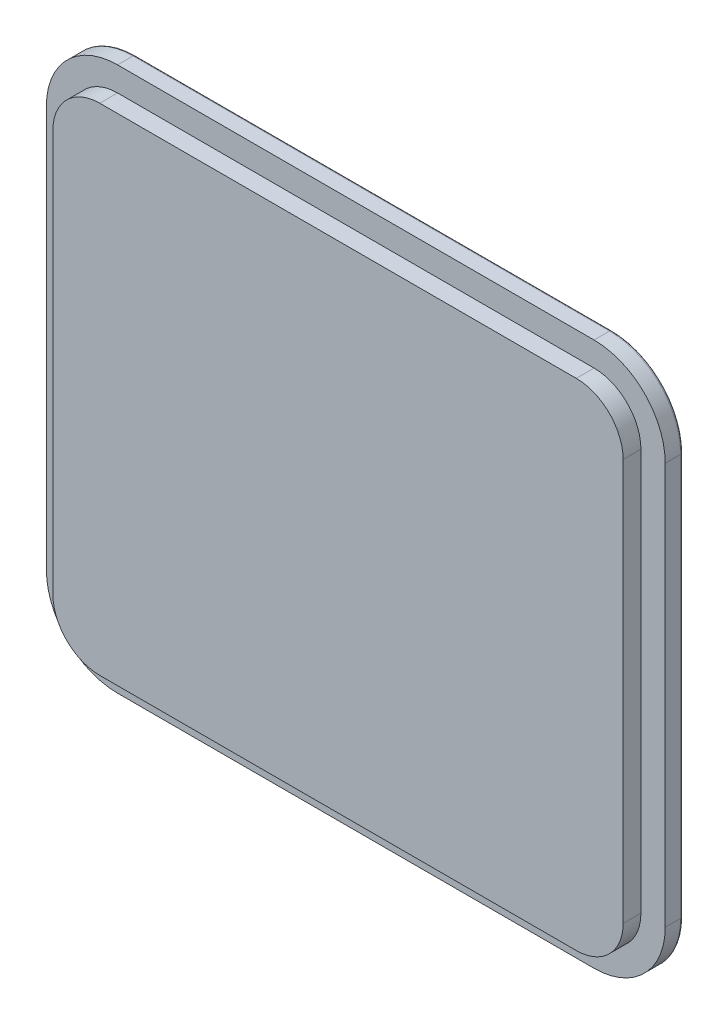
ISO-10303-21;
HEADER;
FILE_DESCRIPTION(('STEP AP214'),'2;1');
FILE_NAME('part.step','',(''),(''),'','','');
FILE_SCHEMA(('AUTOMOTIVE_DESIGN { 1 0 10303 214 1 1 1 1 }'));
ENDSEC;
DATA;
#1=APPLICATION_CONTEXT('core data for automotive mechanical design processes');
#2=APPLICATION_PROTOCOL_DEFINITION('international standard','automotive_design',2000,#1);
#3=PRODUCT_CONTEXT('',#1,'mechanical');
#4=PRODUCT('Part','Part','',(#3));
#5=PRODUCT_RELATED_PRODUCT_CATEGORY('part','',(#4));
#6=PRODUCT_DEFINITION_FORMATION('','',#4);
#7=PRODUCT_DEFINITION_CONTEXT('part definition',#1,'design');
#8=PRODUCT_DEFINITION('design','',#6,#7);
#9=PRODUCT_DEFINITION_SHAPE('','',#8);
#10=(LENGTH_UNIT() NAMED_UNIT(*) SI_UNIT(.MILLI.,.METRE.));
#11=(NAMED_UNIT(*) PLANE_ANGLE_UNIT() SI_UNIT($,.RADIAN.));
#12=(NAMED_UNIT(*) SI_UNIT($,.STERADIAN.) SOLID_ANGLE_UNIT());
#13=UNCERTAINTY_MEASURE_WITH_UNIT(LENGTH_MEASURE(1.E-05),#10,'distance_accuracy_value','');
#14=(GEOMETRIC_REPRESENTATION_CONTEXT(3) GLOBAL_UNCERTAINTY_ASSIGNED_CONTEXT((#13)) GLOBAL_UNIT_ASSIGNED_CONTEXT((#10,
#11,#12)) REPRESENTATION_CONTEXT('',''));
#15=CARTESIAN_POINT('',(0.,0.,0.));
#16=DIRECTION('',(0.,0.,1.));
#17=DIRECTION('',(1.,0.,0.));
#18=AXIS2_PLACEMENT_3D('',#15,#16,#17);
#19=CARTESIAN_POINT('',(18.7742414137238,19.199439056109,3.));
#20=DIRECTION('',(0.,0.,-1.));
#21=DIRECTION('',(-1.,0.,0.));
#22=AXIS2_PLACEMENT_3D('',#19,#20,#21);
#23=CYLINDRICAL_SURFACE('',#22,3.95);
#24=DIRECTION('',(0.,0.,-1.));
#25=VECTOR('',#24,1.);
#26=CARTESIAN_POINT('',(22.7242414137238,19.1994390561089,3.));
#27=LINE('',#26,#25);
#28=CARTESIAN_POINT('',(22.7242414137238,19.1994390561089,3.));
#29=VERTEX_POINT('',#28);
#30=CARTESIAN_POINT('',(22.7242414137238,19.1994390561089,1.5));
#31=VERTEX_POINT('',#30);
#32=EDGE_CURVE('E329',#29,#31,#27,.T.);
#33=ORIENTED_EDGE('',*,*,#32,.T.);
#34=CARTESIAN_POINT('',(18.7742414137238,19.199439056109,1.5));
#35=DIRECTION('',(0.,0.,1.));
#36=DIRECTION('',(1.,0.,0.));
#37=AXIS2_PLACEMENT_3D('',#34,#35,#36);
#38=CIRCLE('',#37,3.95);
#39=CARTESIAN_POINT('',(18.7742414137237,23.149439056109,1.5));
#40=VERTEX_POINT('',#39);
#41=EDGE_CURVE('E360',#31,#40,#38,.T.);
#42=ORIENTED_EDGE('',*,*,#41,.T.);
#43=DIRECTION('',(0.,0.,-1.));
#44=VECTOR('',#43,1.);
#45=CARTESIAN_POINT('',(18.7742414137237,23.149439056109,3.));
#46=LINE('',#45,#44);
#47=CARTESIAN_POINT('',(18.7742414137237,23.149439056109,3.));
#48=VERTEX_POINT('',#47);
#49=EDGE_CURVE('E201',#48,#40,#46,.T.);
#50=ORIENTED_EDGE('',*,*,#49,.F.);
#51=CARTESIAN_POINT('',(18.7742414137238,19.199439056109,3.));
#52=DIRECTION('',(0.,0.,1.));
#53=DIRECTION('',(1.,0.,0.));
#54=AXIS2_PLACEMENT_3D('',#51,#52,#53);
#55=CIRCLE('',#54,3.95);
#56=EDGE_CURVE('E314',#29,#48,#55,.T.);
#57=ORIENTED_EDGE('',*,*,#56,.F.);
#58=EDGE_LOOP('',(#33,#42,#50,#57));
#59=FACE_BOUND('',#58,.T.);
#60=ADVANCED_FACE('F39',(#59),#23,.T.);
#61=CARTESIAN_POINT('',(18.7742414137237,23.149439056109,3.));
#62=DIRECTION('',(0.,-1.,0.));
#63=DIRECTION('',(0.,0.,-1.));
#64=AXIS2_PLACEMENT_3D('',#61,#62,#63);
#65=PLANE('',#64);
#66=ORIENTED_EDGE('',*,*,#49,.T.);
#67=DIRECTION('',(-1.,0.,0.));
#68=VECTOR('',#67,1.);
#69=CARTESIAN_POINT('',(18.7742414137237,23.149439056109,1.5));
#70=LINE('',#69,#68);
#71=CARTESIAN_POINT('',(-21.4042605704253,23.149439056109,1.5));
#72=VERTEX_POINT('',#71);
#73=EDGE_CURVE('E363',#40,#72,#70,.T.);
#74=ORIENTED_EDGE('',*,*,#73,.T.);
#75=DIRECTION('',(0.,0.,-1.));
#76=VECTOR('',#75,1.);
#77=CARTESIAN_POINT('',(-21.4042605704253,23.149439056109,3.));
#78=LINE('',#77,#76);
#79=CARTESIAN_POINT('',(-21.4042605704253,23.149439056109,3.));
#80=VERTEX_POINT('',#79);
#81=EDGE_CURVE('E198',#80,#72,#78,.T.);
#82=ORIENTED_EDGE('',*,*,#81,.F.);
#83=DIRECTION('',(-1.,0.,0.));
#84=VECTOR('',#83,1.);
#85=CARTESIAN_POINT('',(18.7742414137237,23.149439056109,3.));
#86=LINE('',#85,#84);
#87=EDGE_CURVE('E320',#48,#80,#86,.T.);
#88=ORIENTED_EDGE('',*,*,#87,.F.);
#89=EDGE_LOOP('',(#66,#74,#82,#88));
#90=FACE_BOUND('',#89,.T.);
#91=ADVANCED_FACE('F403',(#90),#65,.F.);
#92=CARTESIAN_POINT('',(-21.4042605704253,19.199439056109,3.));
#93=DIRECTION('',(0.,0.,-1.));
#94=DIRECTION('',(-1.,0.,0.));
#95=AXIS2_PLACEMENT_3D('',#92,#93,#94);
#96=CYLINDRICAL_SURFACE('',#95,3.95);
#97=CARTESIAN_POINT('',(-21.4042605704253,19.199439056109,1.5));
#98=DIRECTION('',(0.,0.,1.));
#99=DIRECTION('',(-1.,0.,0.));
#100=AXIS2_PLACEMENT_3D('',#97,#98,#99);
#101=CIRCLE('',#100,3.95);
#102=CARTESIAN_POINT('',(-25.3542605704253,19.1994390561089,1.5));
#103=VERTEX_POINT('',#102);
#104=EDGE_CURVE('E177',#72,#103,#101,.T.);
#105=ORIENTED_EDGE('',*,*,#104,.T.);
#106=DIRECTION('',(0.,0.,-1.));
#107=VECTOR('',#106,1.);
#108=CARTESIAN_POINT('',(-25.3542605704253,19.1994390561089,3.));
#109=LINE('',#108,#107);
#110=CARTESIAN_POINT('',(-25.3542605704253,19.1994390561089,3.));
#111=VERTEX_POINT('',#110);
#112=EDGE_CURVE('E195',#111,#103,#109,.T.);
#113=ORIENTED_EDGE('',*,*,#112,.F.);
#114=CARTESIAN_POINT('',(-21.4042605704253,19.199439056109,3.));
#115=DIRECTION('',(0.,0.,-1.));
#116=DIRECTION('',(-1.,0.,0.));
#117=AXIS2_PLACEMENT_3D('',#114,#115,#116);
#118=CIRCLE('',#117,3.95);
#119=EDGE_CURVE('E317',#111,#80,#118,.T.);
#120=ORIENTED_EDGE('',*,*,#119,.T.);
#121=ORIENTED_EDGE('',*,*,#81,.T.);
#122=EDGE_LOOP('',(#105,#113,#120,#121));
#123=FACE_BOUND('',#122,.T.);
#124=ADVANCED_FACE('F194',(#123),#96,.T.);
#125=CARTESIAN_POINT('',(-25.3542605704253,19.1994390561089,3.));
#126=DIRECTION('',(1.,0.,0.));
#127=DIRECTION('',(0.,0.,-1.));
#128=AXIS2_PLACEMENT_3D('',#125,#126,#127);
#129=PLANE('',#128);
#130=ORIENTED_EDGE('',*,*,#112,.T.);
#131=DIRECTION('',(0.,-1.,0.));
#132=VECTOR('',#131,1.);
#133=CARTESIAN_POINT('',(-25.3542605704253,19.1994390561089,1.5));
#134=LINE('',#133,#132);
#135=CARTESIAN_POINT('',(-25.3542605704253,-14.6814883527179,1.5));
#136=VERTEX_POINT('',#135);
#137=EDGE_CURVE('E176',#103,#136,#134,.T.);
#138=ORIENTED_EDGE('',*,*,#137,.T.);
#139=DIRECTION('',(0.,0.,-1.));
#140=VECTOR('',#139,1.);
#141=CARTESIAN_POINT('',(-25.3542605704253,-14.6814883527179,3.));
#142=LINE('',#141,#140);
#143=CARTESIAN_POINT('',(-25.3542605704253,-14.6814883527179,3.));
#144=VERTEX_POINT('',#143);
#145=EDGE_CURVE('E203',#144,#136,#142,.T.);
#146=ORIENTED_EDGE('',*,*,#145,.F.);
#147=DIRECTION('',(0.,-1.,0.));
#148=VECTOR('',#147,1.);
#149=CARTESIAN_POINT('',(-25.3542605704253,19.1994390561089,3.));
#150=LINE('',#149,#148);
#151=EDGE_CURVE('E200',#111,#144,#150,.T.);
#152=ORIENTED_EDGE('',*,*,#151,.F.);
#153=EDGE_LOOP('',(#130,#138,#146,#152));
#154=FACE_BOUND('',#153,.T.);
#155=ADVANCED_FACE('F196',(#154),#129,.F.);
#156=CARTESIAN_POINT('',(-21.4042605704253,-14.6814883527179,3.));
#157=DIRECTION('',(0.,0.,-1.));
#158=DIRECTION('',(-1.,0.,0.));
#159=AXIS2_PLACEMENT_3D('',#156,#157,#158);
#160=CYLINDRICAL_SURFACE('',#159,3.95);
#161=ORIENTED_EDGE('',*,*,#145,.T.);
#162=CARTESIAN_POINT('',(-21.4042605704253,-14.6814883527179,1.5));
#163=DIRECTION('',(0.,0.,1.));
#164=DIRECTION('',(1.,0.,0.));
#165=AXIS2_PLACEMENT_3D('',#162,#163,#164);
#166=CIRCLE('',#165,3.95);
#167=CARTESIAN_POINT('',(-21.4042605704253,-18.6314883527179,1.5));
#168=VERTEX_POINT('',#167);
#169=EDGE_CURVE('E181',#136,#168,#166,.T.);
#170=ORIENTED_EDGE('',*,*,#169,.T.);
#171=DIRECTION('',(0.,0.,-1.));
#172=VECTOR('',#171,1.);
#173=CARTESIAN_POINT('',(-21.4042605704253,-18.6314883527179,3.));
#174=LINE('',#173,#172);
#175=CARTESIAN_POINT('',(-21.4042605704253,-18.6314883527179,3.));
#176=VERTEX_POINT('',#175);
#177=EDGE_CURVE('E202',#176,#168,#174,.T.);
#178=ORIENTED_EDGE('',*,*,#177,.F.);
#179=CARTESIAN_POINT('',(-21.4042605704253,-14.6814883527179,3.));
#180=DIRECTION('',(0.,0.,1.));
#181=DIRECTION('',(1.,0.,0.));
#182=AXIS2_PLACEMENT_3D('',#179,#180,#181);
#183=CIRCLE('',#182,3.95);
#184=EDGE_CURVE('E325',#144,#176,#183,.T.);
#185=ORIENTED_EDGE('',*,*,#184,.F.);
#186=EDGE_LOOP('',(#161,#170,#178,#185));
#187=FACE_BOUND('',#186,.T.);
#188=ADVANCED_FACE('F346',(#187),#160,.T.);
#189=CARTESIAN_POINT('',(-21.4042605704253,-18.6314883527179,3.));
#190=DIRECTION('',(0.,1.,0.));
#191=DIRECTION('',(0.,0.,1.));
#192=AXIS2_PLACEMENT_3D('',#189,#190,#191);
#193=PLANE('',#192);
#194=ORIENTED_EDGE('',*,*,#177,.T.);
#195=DIRECTION('',(1.,0.,0.));
#196=VECTOR('',#195,1.);
#197=CARTESIAN_POINT('',(-21.4042605704253,-18.6314883527179,1.5));
#198=LINE('',#197,#196);
#199=CARTESIAN_POINT('',(18.7742414137237,-18.6314883527179,1.5));
#200=VERTEX_POINT('',#199);
#201=EDGE_CURVE('E342',#168,#200,#198,.T.);
#202=ORIENTED_EDGE('',*,*,#201,.T.);
#203=DIRECTION('',(0.,0.,-1.));
#204=VECTOR('',#203,1.);
#205=CARTESIAN_POINT('',(18.7742414137237,-18.6314883527179,3.));
#206=LINE('',#205,#204);
#207=CARTESIAN_POINT('',(18.7742414137237,-18.6314883527179,3.));
#208=VERTEX_POINT('',#207);
#209=EDGE_CURVE('E338',#208,#200,#206,.T.);
#210=ORIENTED_EDGE('',*,*,#209,.F.);
#211=DIRECTION('',(1.,0.,0.));
#212=VECTOR('',#211,1.);
#213=CARTESIAN_POINT('',(-21.4042605704253,-18.6314883527179,3.));
#214=LINE('',#213,#212);
#215=EDGE_CURVE('E322',#176,#208,#214,.T.);
#216=ORIENTED_EDGE('',*,*,#215,.F.);
#217=EDGE_LOOP('',(#194,#202,#210,#216));
#218=FACE_BOUND('',#217,.T.);
#219=ADVANCED_FACE('F345',(#218),#193,.F.);
#220=CARTESIAN_POINT('',(18.7742414137238,-14.6814883527179,3.));
#221=DIRECTION('',(0.,0.,-1.));
#222=DIRECTION('',(-1.,0.,0.));
#223=AXIS2_PLACEMENT_3D('',#220,#221,#222);
#224=CYLINDRICAL_SURFACE('',#223,3.95);
#225=ORIENTED_EDGE('',*,*,#209,.T.);
#226=CARTESIAN_POINT('',(18.7742414137238,-14.6814883527179,1.5));
#227=DIRECTION('',(0.,0.,1.));
#228=DIRECTION('',(1.,0.,0.));
#229=AXIS2_PLACEMENT_3D('',#226,#227,#228);
#230=CIRCLE('',#229,3.95);
#231=CARTESIAN_POINT('',(22.7242414137238,-14.6814883527179,1.5));
#232=VERTEX_POINT('',#231);
#233=EDGE_CURVE('E348',#200,#232,#230,.T.);
#234=ORIENTED_EDGE('',*,*,#233,.T.);
#235=DIRECTION('',(0.,0.,-1.));
#236=VECTOR('',#235,1.);
#237=CARTESIAN_POINT('',(22.7242414137238,-14.6814883527179,3.));
#238=LINE('',#237,#236);
#239=CARTESIAN_POINT('',(22.7242414137238,-14.6814883527179,3.));
#240=VERTEX_POINT('',#239);
#241=EDGE_CURVE('E334',#240,#232,#238,.T.);
#242=ORIENTED_EDGE('',*,*,#241,.F.);
#243=CARTESIAN_POINT('',(18.7742414137238,-14.6814883527179,3.));
#244=DIRECTION('',(0.,0.,1.));
#245=DIRECTION('',(1.,0.,0.));
#246=AXIS2_PLACEMENT_3D('',#243,#244,#245);
#247=CIRCLE('',#246,3.95);
#248=EDGE_CURVE('E326',#208,#240,#247,.T.);
#249=ORIENTED_EDGE('',*,*,#248,.F.);
#250=EDGE_LOOP('',(#225,#234,#242,#249));
#251=FACE_BOUND('',#250,.T.);
#252=ADVANCED_FACE('F425',(#251),#224,.T.);
#253=CARTESIAN_POINT('',(22.7242414137238,-14.6814883527179,3.));
#254=DIRECTION('',(-1.,0.,0.));
#255=DIRECTION('',(0.,0.,1.));
#256=AXIS2_PLACEMENT_3D('',#253,#254,#255);
#257=PLANE('',#256);
#258=ORIENTED_EDGE('',*,*,#241,.T.);
#259=DIRECTION('',(0.,1.,0.));
#260=VECTOR('',#259,1.);
#261=CARTESIAN_POINT('',(22.7242414137238,-14.6814883527179,1.5));
#262=LINE('',#261,#260);
#263=EDGE_CURVE('E354',#232,#31,#262,.T.);
#264=ORIENTED_EDGE('',*,*,#263,.T.);
#265=ORIENTED_EDGE('',*,*,#32,.F.);
#266=DIRECTION('',(0.,1.,0.));
#267=VECTOR('',#266,1.);
#268=CARTESIAN_POINT('',(22.7242414137238,-14.6814883527179,3.));
#269=LINE('',#268,#267);
#270=EDGE_CURVE('E327',#240,#29,#269,.T.);
#271=ORIENTED_EDGE('',*,*,#270,.F.);
#272=EDGE_LOOP('',(#258,#264,#265,#271));
#273=FACE_BOUND('',#272,.T.);
#274=ADVANCED_FACE('F422',(#273),#257,.F.);
#275=CARTESIAN_POINT('',(18.7742414137238,19.199439056109,3.));
#276=DIRECTION('',(0.,0.,1.));
#277=DIRECTION('',(1.,0.,0.));
#278=AXIS2_PLACEMENT_3D('',#275,#276,#277);
#279=PLANE('',#278);
#280=ORIENTED_EDGE('',*,*,#56,.T.);
#281=ORIENTED_EDGE('',*,*,#87,.T.);
#282=ORIENTED_EDGE('',*,*,#119,.F.);
#283=ORIENTED_EDGE('',*,*,#151,.T.);
#284=ORIENTED_EDGE('',*,*,#184,.T.);
#285=ORIENTED_EDGE('',*,*,#215,.T.);
#286=ORIENTED_EDGE('',*,*,#248,.T.);
#287=ORIENTED_EDGE('',*,*,#270,.T.);
#288=EDGE_LOOP('',(#280,#281,#282,#283,#284,#285,#286,#287));
#289=FACE_BOUND('',#288,.T.);
#290=ADVANCED_FACE('F427',(#289),#279,.T.);
#291=CARTESIAN_POINT('',(-21.4042605704253,-14.6814883527179,1.5));
#292=DIRECTION('',(0.,0.,1.));
#293=DIRECTION('',(1.,0.,0.));
#294=AXIS2_PLACEMENT_3D('',#291,#292,#293);
#295=PLANE('',#294);
#296=CARTESIAN_POINT('',(-21.4042605704253,-14.6814883527179,1.5));
#297=DIRECTION('',(0.,0.,1.));
#298=DIRECTION('',(1.,0.,0.));
#299=AXIS2_PLACEMENT_3D('',#296,#297,#298);
#300=CIRCLE('',#299,6.);
#301=CARTESIAN_POINT('',(-27.4042605704253,-14.6814883527179,1.5));
#302=VERTEX_POINT('',#301);
#303=CARTESIAN_POINT('',(-21.4042605704253,-20.6814883527179,1.5));
#304=VERTEX_POINT('',#303);
#305=EDGE_CURVE('E361',#302,#304,#300,.T.);
#306=ORIENTED_EDGE('',*,*,#305,.T.);
#307=DIRECTION('',(1.,0.,0.));
#308=VECTOR('',#307,1.);
#309=CARTESIAN_POINT('',(-21.4042605704253,-20.6814883527179,1.5));
#310=LINE('',#309,#308);
#311=CARTESIAN_POINT('',(18.7742414137237,-20.6814883527179,1.5));
#312=VERTEX_POINT('',#311);
#313=EDGE_CURVE('E368',#304,#312,#310,.T.);
#314=ORIENTED_EDGE('',*,*,#313,.T.);
#315=CARTESIAN_POINT('',(18.7742414137238,-14.6814883527179,1.5));
#316=DIRECTION('',(0.,0.,1.));
#317=DIRECTION('',(1.,0.,0.));
#318=AXIS2_PLACEMENT_3D('',#315,#316,#317);
#319=CIRCLE('',#318,6.);
#320=CARTESIAN_POINT('',(24.7742414137238,-14.6814883527179,1.5));
#321=VERTEX_POINT('',#320);
#322=EDGE_CURVE('E366',#312,#321,#319,.T.);
#323=ORIENTED_EDGE('',*,*,#322,.T.);
#324=DIRECTION('',(0.,1.,0.));
#325=VECTOR('',#324,1.);
#326=CARTESIAN_POINT('',(24.7742414137238,-14.6814883527179,1.5));
#327=LINE('',#326,#325);
#328=CARTESIAN_POINT('',(24.7742414137238,19.1994390561089,1.5));
#329=VERTEX_POINT('',#328);
#330=EDGE_CURVE('E367',#321,#329,#327,.T.);
#331=ORIENTED_EDGE('',*,*,#330,.T.);
#332=CARTESIAN_POINT('',(18.7742414137238,19.199439056109,1.5));
#333=DIRECTION('',(0.,0.,1.));
#334=DIRECTION('',(1.,0.,0.));
#335=AXIS2_PLACEMENT_3D('',#332,#333,#334);
#336=CIRCLE('',#335,6.);
#337=CARTESIAN_POINT('',(18.7742414137237,25.199439056109,1.5));
#338=VERTEX_POINT('',#337);
#339=EDGE_CURVE('E299',#329,#338,#336,.T.);
#340=ORIENTED_EDGE('',*,*,#339,.T.);
#341=DIRECTION('',(-1.,0.,0.));
#342=VECTOR('',#341,1.);
#343=CARTESIAN_POINT('',(18.7742414137237,25.199439056109,1.5));
#344=LINE('',#343,#342);
#345=CARTESIAN_POINT('',(-21.4042605704253,25.199439056109,1.5));
#346=VERTEX_POINT('',#345);
#347=EDGE_CURVE('E373',#338,#346,#344,.T.);
#348=ORIENTED_EDGE('',*,*,#347,.T.);
#349=CARTESIAN_POINT('',(-21.4042605704253,19.199439056109,1.5));
#350=DIRECTION('',(0.,0.,1.));
#351=DIRECTION('',(-1.,0.,0.));
#352=AXIS2_PLACEMENT_3D('',#349,#350,#351);
#353=CIRCLE('',#352,6.);
#354=CARTESIAN_POINT('',(-27.4042605704253,19.1994390561089,1.5));
#355=VERTEX_POINT('',#354);
#356=EDGE_CURVE('E374',#346,#355,#353,.T.);
#357=ORIENTED_EDGE('',*,*,#356,.T.);
#358=DIRECTION('',(0.,-1.,0.));
#359=VECTOR('',#358,1.);
#360=CARTESIAN_POINT('',(-27.4042605704253,19.1994390561089,1.5));
#361=LINE('',#360,#359);
#362=EDGE_CURVE('E380',#355,#302,#361,.T.);
#363=ORIENTED_EDGE('',*,*,#362,.T.);
#364=EDGE_LOOP('',(#306,#314,#323,#331,#340,#348,#357,#363));
#365=FACE_BOUND('',#364,.T.);
#366=ORIENTED_EDGE('',*,*,#137,.F.);
#367=ORIENTED_EDGE('',*,*,#104,.F.);
#368=ORIENTED_EDGE('',*,*,#73,.F.);
#369=ORIENTED_EDGE('',*,*,#41,.F.);
#370=ORIENTED_EDGE('',*,*,#263,.F.);
#371=ORIENTED_EDGE('',*,*,#233,.F.);
#372=ORIENTED_EDGE('',*,*,#201,.F.);
#373=ORIENTED_EDGE('',*,*,#169,.F.);
#374=EDGE_LOOP('',(#366,#367,#368,#369,#370,#371,#372,#373));
#375=FACE_BOUND('',#374,.T.);
#376=ADVANCED_FACE('F178',(#365,#375),#295,.T.);
#377=CARTESIAN_POINT('',(-21.4042605704253,-14.6814883527179,1.5));
#378=DIRECTION('',(0.,0.,-1.));
#379=DIRECTION('',(-1.,0.,0.));
#380=AXIS2_PLACEMENT_3D('',#377,#378,#379);
#381=CYLINDRICAL_SURFACE('',#380,6.);
#382=DIRECTION('',(0.,0.,-1.));
#383=VECTOR('',#382,1.);
#384=CARTESIAN_POINT('',(-27.4042605704253,-14.6814883527179,1.5));
#385=LINE('',#384,#383);
#386=CARTESIAN_POINT('',(-27.4042605704253,-14.6814883527179,0.2));
#387=VERTEX_POINT('',#386);
#388=EDGE_CURVE('E377',#302,#387,#385,.T.);
#389=ORIENTED_EDGE('',*,*,#388,.T.);
#390=CARTESIAN_POINT('',(-21.4042605704253,-14.6814883527179,0.2));
#391=DIRECTION('',(0.,0.,1.));
#392=DIRECTION('',(1.,0.,0.));
#393=AXIS2_PLACEMENT_3D('',#390,#391,#392);
#394=CIRCLE('',#393,6.);
#395=CARTESIAN_POINT('',(-21.4042605704253,-20.6814883527179,0.2));
#396=VERTEX_POINT('',#395);
#397=EDGE_CURVE('E240',#387,#396,#394,.T.);
#398=ORIENTED_EDGE('',*,*,#397,.T.);
#399=DIRECTION('',(0.,0.,-1.));
#400=VECTOR('',#399,1.);
#401=CARTESIAN_POINT('',(-21.4042605704253,-20.6814883527179,1.5));
#402=LINE('',#401,#400);
#403=EDGE_CURVE('E313',#304,#396,#402,.T.);
#404=ORIENTED_EDGE('',*,*,#403,.F.);
#405=ORIENTED_EDGE('',*,*,#305,.F.);
#406=EDGE_LOOP('',(#389,#398,#404,#405));
#407=FACE_BOUND('',#406,.T.);
#408=ADVANCED_FACE('F436',(#407),#381,.T.);
#409=CARTESIAN_POINT('',(-21.4042605704253,-20.6814883527179,1.5));
#410=DIRECTION('',(0.,1.,0.));
#411=DIRECTION('',(0.,0.,1.));
#412=AXIS2_PLACEMENT_3D('',#409,#410,#411);
#413=PLANE('',#412);
#414=ORIENTED_EDGE('',*,*,#403,.T.);
#415=DIRECTION('',(1.,0.,0.));
#416=VECTOR('',#415,1.);
#417=CARTESIAN_POINT('',(-21.4042605704253,-20.6814883527179,0.2));
#418=LINE('',#417,#416);
#419=CARTESIAN_POINT('',(18.7742414137237,-20.6814883527179,0.2));
#420=VERTEX_POINT('',#419);
#421=EDGE_CURVE('E232',#396,#420,#418,.T.);
#422=ORIENTED_EDGE('',*,*,#421,.T.);
#423=DIRECTION('',(0.,0.,-1.));
#424=VECTOR('',#423,1.);
#425=CARTESIAN_POINT('',(18.7742414137237,-20.6814883527179,1.5));
#426=LINE('',#425,#424);
#427=EDGE_CURVE('E305',#312,#420,#426,.T.);
#428=ORIENTED_EDGE('',*,*,#427,.F.);
#429=ORIENTED_EDGE('',*,*,#313,.F.);
#430=EDGE_LOOP('',(#414,#422,#428,#429));
#431=FACE_BOUND('',#430,.T.);
#432=ADVANCED_FACE('F438',(#431),#413,.F.);
#433=CARTESIAN_POINT('',(18.7742414137238,-14.6814883527179,1.5));
#434=DIRECTION('',(0.,0.,-1.));
#435=DIRECTION('',(-1.,0.,0.));
#436=AXIS2_PLACEMENT_3D('',#433,#434,#435);
#437=CYLINDRICAL_SURFACE('',#436,6.);
#438=ORIENTED_EDGE('',*,*,#427,.T.);
#439=CARTESIAN_POINT('',(18.7742414137238,-14.6814883527179,0.2));
#440=DIRECTION('',(0.,0.,1.));
#441=DIRECTION('',(1.,0.,0.));
#442=AXIS2_PLACEMENT_3D('',#439,#440,#441);
#443=CIRCLE('',#442,6.);
#444=CARTESIAN_POINT('',(24.7742414137238,-14.6814883527179,0.2));
#445=VERTEX_POINT('',#444);
#446=EDGE_CURVE('E235',#420,#445,#443,.T.);
#447=ORIENTED_EDGE('',*,*,#446,.T.);
#448=DIRECTION('',(0.,0.,-1.));
#449=VECTOR('',#448,1.);
#450=CARTESIAN_POINT('',(24.7742414137238,-14.6814883527179,1.5));
#451=LINE('',#450,#449);
#452=EDGE_CURVE('E298',#321,#445,#451,.T.);
#453=ORIENTED_EDGE('',*,*,#452,.F.);
#454=ORIENTED_EDGE('',*,*,#322,.F.);
#455=EDGE_LOOP('',(#438,#447,#453,#454));
#456=FACE_BOUND('',#455,.T.);
#457=ADVANCED_FACE('F444',(#456),#437,.T.);
#458=CARTESIAN_POINT('',(24.7742414137238,-14.6814883527179,1.5));
#459=DIRECTION('',(-1.,0.,0.));
#460=DIRECTION('',(0.,0.,1.));
#461=AXIS2_PLACEMENT_3D('',#458,#459,#460);
#462=PLANE('',#461);
#463=ORIENTED_EDGE('',*,*,#452,.T.);
#464=DIRECTION('',(0.,1.,0.));
#465=VECTOR('',#464,1.);
#466=CARTESIAN_POINT('',(24.7742414137238,-14.6814883527179,0.2));
#467=LINE('',#466,#465);
#468=CARTESIAN_POINT('',(24.7742414137238,19.1994390561089,0.2));
#469=VERTEX_POINT('',#468);
#470=EDGE_CURVE('E234',#445,#469,#467,.T.);
#471=ORIENTED_EDGE('',*,*,#470,.T.);
#472=DIRECTION('',(0.,0.,-1.));
#473=VECTOR('',#472,1.);
#474=CARTESIAN_POINT('',(24.7742414137238,19.1994390561089,1.5));
#475=LINE('',#474,#473);
#476=EDGE_CURVE('E291',#329,#469,#475,.T.);
#477=ORIENTED_EDGE('',*,*,#476,.F.);
#478=ORIENTED_EDGE('',*,*,#330,.F.);
#479=EDGE_LOOP('',(#463,#471,#477,#478));
#480=FACE_BOUND('',#479,.T.);
#481=ADVANCED_FACE('F292',(#480),#462,.F.);
#482=CARTESIAN_POINT('',(18.7742414137238,19.199439056109,1.5));
#483=DIRECTION('',(0.,0.,-1.));
#484=DIRECTION('',(-1.,0.,0.));
#485=AXIS2_PLACEMENT_3D('',#482,#483,#484);
#486=CYLINDRICAL_SURFACE('',#485,6.);
#487=ORIENTED_EDGE('',*,*,#476,.T.);
#488=CARTESIAN_POINT('',(18.7742414137238,19.199439056109,0.2));
#489=DIRECTION('',(0.,0.,1.));
#490=DIRECTION('',(1.,0.,0.));
#491=AXIS2_PLACEMENT_3D('',#488,#489,#490);
#492=CIRCLE('',#491,6.);
#493=CARTESIAN_POINT('',(18.7742414137237,25.199439056109,0.2));
#494=VERTEX_POINT('',#493);
#495=EDGE_CURVE('E211',#469,#494,#492,.T.);
#496=ORIENTED_EDGE('',*,*,#495,.T.);
#497=DIRECTION('',(0.,0.,-1.));
#498=VECTOR('',#497,1.);
#499=CARTESIAN_POINT('',(18.7742414137237,25.199439056109,1.5));
#500=LINE('',#499,#498);
#501=EDGE_CURVE('E304',#338,#494,#500,.T.);
#502=ORIENTED_EDGE('',*,*,#501,.F.);
#503=ORIENTED_EDGE('',*,*,#339,.F.);
#504=EDGE_LOOP('',(#487,#496,#502,#503));
#505=FACE_BOUND('',#504,.T.);
#506=ADVANCED_FACE('F296',(#505),#486,.T.);
#507=CARTESIAN_POINT('',(18.7742414137237,25.199439056109,1.5));
#508=DIRECTION('',(0.,-1.,0.));
#509=DIRECTION('',(0.,0.,-1.));
#510=AXIS2_PLACEMENT_3D('',#507,#508,#509);
#511=PLANE('',#510);
#512=ORIENTED_EDGE('',*,*,#501,.T.);
#513=DIRECTION('',(-1.,0.,0.));
#514=VECTOR('',#513,1.);
#515=CARTESIAN_POINT('',(18.7742414137237,25.199439056109,0.2));
#516=LINE('',#515,#514);
#517=CARTESIAN_POINT('',(-21.4042605704253,25.199439056109,0.2));
#518=VERTEX_POINT('',#517);
#519=EDGE_CURVE('E11',#494,#518,#516,.T.);
#520=ORIENTED_EDGE('',*,*,#519,.T.);
#521=DIRECTION('',(0.,0.,-1.));
#522=VECTOR('',#521,1.);
#523=CARTESIAN_POINT('',(-21.4042605704253,25.199439056109,1.5));
#524=LINE('',#523,#522);
#525=EDGE_CURVE('E302',#346,#518,#524,.T.);
#526=ORIENTED_EDGE('',*,*,#525,.F.);
#527=ORIENTED_EDGE('',*,*,#347,.F.);
#528=EDGE_LOOP('',(#512,#520,#526,#527));
#529=FACE_BOUND('',#528,.T.);
#530=ADVANCED_FACE('F451',(#529),#511,.F.);
#531=CARTESIAN_POINT('',(-21.4042605704253,19.199439056109,1.5));
#532=DIRECTION('',(0.,0.,-1.));
#533=DIRECTION('',(-1.,0.,0.));
#534=AXIS2_PLACEMENT_3D('',#531,#532,#533);
#535=CYLINDRICAL_SURFACE('',#534,6.);
#536=ORIENTED_EDGE('',*,*,#525,.T.);
#537=CARTESIAN_POINT('',(-21.4042605704253,19.199439056109,0.2));
#538=DIRECTION('',(0.,0.,1.));
#539=DIRECTION('',(1.,0.,0.));
#540=AXIS2_PLACEMENT_3D('',#537,#538,#539);
#541=CIRCLE('',#540,6.);
#542=CARTESIAN_POINT('',(-27.4042605704253,19.1994390561089,0.2));
#543=VERTEX_POINT('',#542);
#544=EDGE_CURVE('E48',#518,#543,#541,.T.);
#545=ORIENTED_EDGE('',*,*,#544,.T.);
#546=DIRECTION('',(0.,0.,-1.));
#547=VECTOR('',#546,1.);
#548=CARTESIAN_POINT('',(-27.4042605704253,19.1994390561089,1.5));
#549=LINE('',#548,#547);
#550=EDGE_CURVE('E385',#355,#543,#549,.T.);
#551=ORIENTED_EDGE('',*,*,#550,.F.);
#552=ORIENTED_EDGE('',*,*,#356,.F.);
#553=EDGE_LOOP('',(#536,#545,#551,#552));
#554=FACE_BOUND('',#553,.T.);
#555=ADVANCED_FACE('F383',(#554),#535,.T.);
#556=CARTESIAN_POINT('',(-27.4042605704253,19.1994390561089,1.5));
#557=DIRECTION('',(1.,0.,0.));
#558=DIRECTION('',(0.,0.,-1.));
#559=AXIS2_PLACEMENT_3D('',#556,#557,#558);
#560=PLANE('',#559);
#561=ORIENTED_EDGE('',*,*,#550,.T.);
#562=DIRECTION('',(0.,-1.,0.));
#563=VECTOR('',#562,1.);
#564=CARTESIAN_POINT('',(-27.4042605704253,19.1994390561089,0.2));
#565=LINE('',#564,#563);
#566=EDGE_CURVE('E239',#543,#387,#565,.T.);
#567=ORIENTED_EDGE('',*,*,#566,.T.);
#568=ORIENTED_EDGE('',*,*,#388,.F.);
#569=ORIENTED_EDGE('',*,*,#362,.F.);
#570=EDGE_LOOP('',(#561,#567,#568,#569));
#571=FACE_BOUND('',#570,.T.);
#572=ADVANCED_FACE('F433',(#571),#560,.F.);
#573=CARTESIAN_POINT('',(18.7742414137238,19.199439056109,0.));
#574=DIRECTION('',(0.,0.,1.));
#575=DIRECTION('',(1.,0.,0.));
#576=AXIS2_PLACEMENT_3D('',#573,#574,#575);
#577=PLANE('',#576);
#578=DIRECTION('',(-1.,0.,0.));
#579=VECTOR('',#578,1.);
#580=CARTESIAN_POINT('',(18.7742414137238,24.999439056109,0.));
#581=LINE('',#580,#579);
#582=CARTESIAN_POINT('',(-21.4042605704253,24.999439056109,0.));
#583=VERTEX_POINT('',#582);
#584=CARTESIAN_POINT('',(18.7742414137237,24.999439056109,0.));
#585=VERTEX_POINT('',#584);
#586=EDGE_CURVE('E212',#583,#585,#581,.F.);
#587=ORIENTED_EDGE('',*,*,#586,.T.);
#588=CARTESIAN_POINT('',(18.7742414137238,19.199439056109,0.));
#589=DIRECTION('',(0.,0.,1.));
#590=DIRECTION('',(1.,0.,0.));
#591=AXIS2_PLACEMENT_3D('',#588,#589,#590);
#592=CIRCLE('',#591,5.8);
#593=CARTESIAN_POINT('',(24.5742414137238,19.1994390561089,0.));
#594=VERTEX_POINT('',#593);
#595=EDGE_CURVE('E226',#585,#594,#592,.F.);
#596=ORIENTED_EDGE('',*,*,#595,.T.);
#597=DIRECTION('',(0.,1.,0.));
#598=VECTOR('',#597,1.);
#599=CARTESIAN_POINT('',(24.5742414137238,19.199439056109,0.));
#600=LINE('',#599,#598);
#601=CARTESIAN_POINT('',(24.5742414137238,-14.6814883527179,0.));
#602=VERTEX_POINT('',#601);
#603=EDGE_CURVE('E228',#594,#602,#600,.F.);
#604=ORIENTED_EDGE('',*,*,#603,.T.);
#605=CARTESIAN_POINT('',(18.7742414137238,-14.6814883527179,0.));
#606=DIRECTION('',(0.,0.,1.));
#607=DIRECTION('',(1.,0.,0.));
#608=AXIS2_PLACEMENT_3D('',#605,#606,#607);
#609=CIRCLE('',#608,5.8);
#610=CARTESIAN_POINT('',(18.7742414137237,-20.4814883527179,0.));
#611=VERTEX_POINT('',#610);
#612=EDGE_CURVE('E221',#602,#611,#609,.F.);
#613=ORIENTED_EDGE('',*,*,#612,.T.);
#614=DIRECTION('',(1.,0.,0.));
#615=VECTOR('',#614,1.);
#616=CARTESIAN_POINT('',(18.7742414137238,-20.4814883527179,0.));
#617=LINE('',#616,#615);
#618=CARTESIAN_POINT('',(-21.4042605704253,-20.4814883527179,0.));
#619=VERTEX_POINT('',#618);
#620=EDGE_CURVE('E225',#611,#619,#617,.F.);
#621=ORIENTED_EDGE('',*,*,#620,.T.);
#622=CARTESIAN_POINT('',(-21.4042605704253,-14.6814883527179,0.));
#623=DIRECTION('',(0.,0.,1.));
#624=DIRECTION('',(1.,0.,0.));
#625=AXIS2_PLACEMENT_3D('',#622,#623,#624);
#626=CIRCLE('',#625,5.8);
#627=CARTESIAN_POINT('',(-27.2042605704253,-14.6814883527179,0.));
#628=VERTEX_POINT('',#627);
#629=EDGE_CURVE('E219',#619,#628,#626,.F.);
#630=ORIENTED_EDGE('',*,*,#629,.T.);
#631=DIRECTION('',(0.,-1.,0.));
#632=VECTOR('',#631,1.);
#633=CARTESIAN_POINT('',(-27.2042605704253,19.199439056109,0.));
#634=LINE('',#633,#632);
#635=CARTESIAN_POINT('',(-27.2042605704253,19.1994390561089,0.));
#636=VERTEX_POINT('',#635);
#637=EDGE_CURVE('E217',#628,#636,#634,.F.);
#638=ORIENTED_EDGE('',*,*,#637,.T.);
#639=CARTESIAN_POINT('',(-21.4042605704253,19.199439056109,0.));
#640=DIRECTION('',(0.,0.,1.));
#641=DIRECTION('',(1.,0.,0.));
#642=AXIS2_PLACEMENT_3D('',#639,#640,#641);
#643=CIRCLE('',#642,5.8);
#644=EDGE_CURVE('E216',#636,#583,#643,.F.);
#645=ORIENTED_EDGE('',*,*,#644,.T.);
#646=EDGE_LOOP('',(#587,#596,#604,#613,#621,#630,#638,#645));
#647=FACE_BOUND('',#646,.T.);
#648=ADVANCED_FACE('F273',(#647),#577,.F.);
#649=CARTESIAN_POINT('',(-21.4042605704253,-14.6814883527179,0.2));
#650=DIRECTION('',(0.,0.,1.));
#651=DIRECTION('',(1.,0.,0.));
#652=AXIS2_PLACEMENT_3D('',#649,#650,#651);
#653=TOROIDAL_SURFACE('',#652,5.8,0.2);
#654=CARTESIAN_POINT('',(-27.2042605704253,-14.6814883527179,0.2));
#655=DIRECTION('',(0.,1.,0.));
#656=DIRECTION('',(-1.,0.,0.));
#657=AXIS2_PLACEMENT_3D('',#654,#655,#656);
#658=CIRCLE('',#657,0.2);
#659=EDGE_CURVE('E260',#628,#387,#658,.T.);
#660=ORIENTED_EDGE('',*,*,#659,.F.);
#661=ORIENTED_EDGE('',*,*,#629,.F.);
#662=CARTESIAN_POINT('',(-21.4042605704253,-20.4814883527179,0.2));
#663=DIRECTION('',(1.,0.,0.));
#664=DIRECTION('',(0.,0.,-1.));
#665=AXIS2_PLACEMENT_3D('',#662,#663,#664);
#666=CIRCLE('',#665,0.2);
#667=EDGE_CURVE('E43',#396,#619,#666,.T.);
#668=ORIENTED_EDGE('',*,*,#667,.F.);
#669=ORIENTED_EDGE('',*,*,#397,.F.);
#670=EDGE_LOOP('',(#660,#661,#668,#669));
#671=FACE_BOUND('',#670,.T.);
#672=ADVANCED_FACE('F41',(#671),#653,.T.);
#673=CARTESIAN_POINT('',(-21.4042605704253,-20.4814883527179,0.2));
#674=DIRECTION('',(1.,0.,0.));
#675=DIRECTION('',(0.,0.,-1.));
#676=AXIS2_PLACEMENT_3D('',#673,#674,#675);
#677=CYLINDRICAL_SURFACE('',#676,0.2);
#678=ORIENTED_EDGE('',*,*,#667,.T.);
#679=ORIENTED_EDGE('',*,*,#620,.F.);
#680=CARTESIAN_POINT('',(18.7742414137237,-20.4814883527179,0.2));
#681=DIRECTION('',(1.,0.,0.));
#682=DIRECTION('',(0.,0.,-1.));
#683=AXIS2_PLACEMENT_3D('',#680,#681,#682);
#684=CIRCLE('',#683,0.2);
#685=EDGE_CURVE('E254',#420,#611,#684,.T.);
#686=ORIENTED_EDGE('',*,*,#685,.F.);
#687=ORIENTED_EDGE('',*,*,#421,.F.);
#688=EDGE_LOOP('',(#678,#679,#686,#687));
#689=FACE_BOUND('',#688,.T.);
#690=ADVANCED_FACE('F268',(#689),#677,.T.);
#691=CARTESIAN_POINT('',(-27.2042605704253,19.1994390561089,0.2));
#692=DIRECTION('',(0.,-1.,0.));
#693=DIRECTION('',(0.,0.,-1.));
#694=AXIS2_PLACEMENT_3D('',#691,#692,#693);
#695=CYLINDRICAL_SURFACE('',#694,0.2);
#696=ORIENTED_EDGE('',*,*,#659,.T.);
#697=ORIENTED_EDGE('',*,*,#566,.F.);
#698=CARTESIAN_POINT('',(-27.2042605704253,19.1994390561089,0.2));
#699=DIRECTION('',(0.,1.,0.));
#700=DIRECTION('',(0.,0.,1.));
#701=AXIS2_PLACEMENT_3D('',#698,#699,#700);
#702=CIRCLE('',#701,0.2);
#703=EDGE_CURVE('E252',#636,#543,#702,.T.);
#704=ORIENTED_EDGE('',*,*,#703,.F.);
#705=ORIENTED_EDGE('',*,*,#637,.F.);
#706=EDGE_LOOP('',(#696,#697,#704,#705));
#707=FACE_BOUND('',#706,.T.);
#708=ADVANCED_FACE('F467',(#707),#695,.T.);
#709=CARTESIAN_POINT('',(18.7742414137238,-14.6814883527179,0.2));
#710=DIRECTION('',(0.,0.,1.));
#711=DIRECTION('',(1.,0.,0.));
#712=AXIS2_PLACEMENT_3D('',#709,#710,#711);
#713=TOROIDAL_SURFACE('',#712,5.8,0.2);
#714=ORIENTED_EDGE('',*,*,#685,.T.);
#715=ORIENTED_EDGE('',*,*,#612,.F.);
#716=CARTESIAN_POINT('',(24.5742414137238,-14.6814883527179,0.2));
#717=DIRECTION('',(0.,1.,0.));
#718=DIRECTION('',(-1.,0.,0.));
#719=AXIS2_PLACEMENT_3D('',#716,#717,#718);
#720=CIRCLE('',#719,0.2);
#721=EDGE_CURVE('E248',#445,#602,#720,.T.);
#722=ORIENTED_EDGE('',*,*,#721,.F.);
#723=ORIENTED_EDGE('',*,*,#446,.F.);
#724=EDGE_LOOP('',(#714,#715,#722,#723));
#725=FACE_BOUND('',#724,.T.);
#726=ADVANCED_FACE('F278',(#725),#713,.T.);
#727=CARTESIAN_POINT('',(-21.4042605704253,19.199439056109,0.2));
#728=DIRECTION('',(0.,0.,1.));
#729=DIRECTION('',(1.,0.,0.));
#730=AXIS2_PLACEMENT_3D('',#727,#728,#729);
#731=TOROIDAL_SURFACE('',#730,5.8,0.2);
#732=ORIENTED_EDGE('',*,*,#703,.T.);
#733=ORIENTED_EDGE('',*,*,#544,.F.);
#734=CARTESIAN_POINT('',(-21.4042605704253,24.999439056109,0.2));
#735=DIRECTION('',(1.,0.,0.));
#736=DIRECTION('',(0.,0.,-1.));
#737=AXIS2_PLACEMENT_3D('',#734,#735,#736);
#738=CIRCLE('',#737,0.2);
#739=EDGE_CURVE('E249',#583,#518,#738,.T.);
#740=ORIENTED_EDGE('',*,*,#739,.F.);
#741=ORIENTED_EDGE('',*,*,#644,.F.);
#742=EDGE_LOOP('',(#732,#733,#740,#741));
#743=FACE_BOUND('',#742,.T.);
#744=ADVANCED_FACE('F389',(#743),#731,.T.);
#745=CARTESIAN_POINT('',(24.5742414137238,-14.6814883527179,0.2));
#746=DIRECTION('',(0.,1.,0.));
#747=DIRECTION('',(0.,0.,1.));
#748=AXIS2_PLACEMENT_3D('',#745,#746,#747);
#749=CYLINDRICAL_SURFACE('',#748,0.2);
#750=ORIENTED_EDGE('',*,*,#721,.T.);
#751=ORIENTED_EDGE('',*,*,#603,.F.);
#752=CARTESIAN_POINT('',(24.5742414137238,19.1994390561089,0.2));
#753=DIRECTION('',(0.,1.,0.));
#754=DIRECTION('',(0.,0.,1.));
#755=AXIS2_PLACEMENT_3D('',#752,#753,#754);
#756=CIRCLE('',#755,0.2);
#757=EDGE_CURVE('E242',#469,#594,#756,.T.);
#758=ORIENTED_EDGE('',*,*,#757,.F.);
#759=ORIENTED_EDGE('',*,*,#470,.F.);
#760=EDGE_LOOP('',(#750,#751,#758,#759));
#761=FACE_BOUND('',#760,.T.);
#762=ADVANCED_FACE('F282',(#761),#749,.T.);
#763=CARTESIAN_POINT('',(18.7742414137237,24.999439056109,0.2));
#764=DIRECTION('',(-1.,0.,0.));
#765=DIRECTION('',(0.,0.,1.));
#766=AXIS2_PLACEMENT_3D('',#763,#764,#765);
#767=CYLINDRICAL_SURFACE('',#766,0.2);
#768=ORIENTED_EDGE('',*,*,#739,.T.);
#769=ORIENTED_EDGE('',*,*,#519,.F.);
#770=CARTESIAN_POINT('',(18.7742414137237,24.999439056109,0.2));
#771=DIRECTION('',(1.,0.,0.));
#772=DIRECTION('',(0.,0.,-1.));
#773=AXIS2_PLACEMENT_3D('',#770,#771,#772);
#774=CIRCLE('',#773,0.2);
#775=EDGE_CURVE('E245',#585,#494,#774,.T.);
#776=ORIENTED_EDGE('',*,*,#775,.F.);
#777=ORIENTED_EDGE('',*,*,#586,.F.);
#778=EDGE_LOOP('',(#768,#769,#776,#777));
#779=FACE_BOUND('',#778,.T.);
#780=ADVANCED_FACE('F395',(#779),#767,.T.);
#781=CARTESIAN_POINT('',(18.7742414137238,19.199439056109,0.2));
#782=DIRECTION('',(0.,0.,1.));
#783=DIRECTION('',(1.,0.,0.));
#784=AXIS2_PLACEMENT_3D('',#781,#782,#783);
#785=TOROIDAL_SURFACE('',#784,5.8,0.2);
#786=ORIENTED_EDGE('',*,*,#757,.T.);
#787=ORIENTED_EDGE('',*,*,#595,.F.);
#788=ORIENTED_EDGE('',*,*,#775,.T.);
#789=ORIENTED_EDGE('',*,*,#495,.F.);
#790=EDGE_LOOP('',(#786,#787,#788,#789));
#791=FACE_BOUND('',#790,.T.);
#792=ADVANCED_FACE('F399',(#791),#785,.T.);
#793=CLOSED_SHELL('',(#60,#91,#124,#155,#188,#219,#252,#274,#290,#376,#408,#432,#457,#481,#506,
#530,#555,#572,#648,#672,#690,#708,#726,#744,#762,#780,#792));
#794=MANIFOLD_SOLID_BREP('B2',#793);
#795=ADVANCED_BREP_SHAPE_REPRESENTATION('',(#18,#794),#14);
#796=SHAPE_DEFINITION_REPRESENTATION(#9,#795);
ENDSEC;
END-ISO-10303-21;
